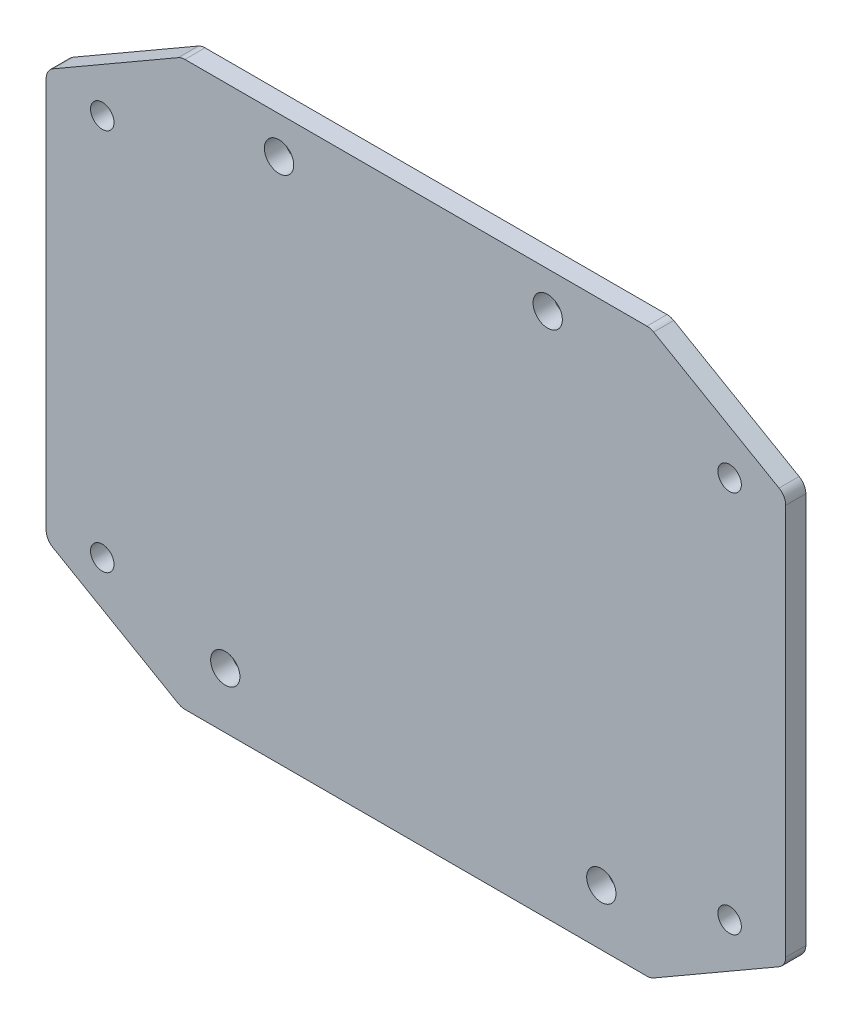
ISO-10303-21;
HEADER;
FILE_DESCRIPTION(('STEP AP214'),'2;1');
FILE_NAME('part.step','',(''),(''),'','','');
FILE_SCHEMA(('AUTOMOTIVE_DESIGN { 1 0 10303 214 1 1 1 1 }'));
ENDSEC;
DATA;
#1=APPLICATION_CONTEXT('core data for automotive mechanical design processes');
#2=APPLICATION_PROTOCOL_DEFINITION('international standard','automotive_design',2000,#1);
#3=PRODUCT_CONTEXT('',#1,'mechanical');
#4=PRODUCT('Part','Part','',(#3));
#5=PRODUCT_RELATED_PRODUCT_CATEGORY('part','',(#4));
#6=PRODUCT_DEFINITION_FORMATION('','',#4);
#7=PRODUCT_DEFINITION_CONTEXT('part definition',#1,'design');
#8=PRODUCT_DEFINITION('design','',#6,#7);
#9=PRODUCT_DEFINITION_SHAPE('','',#8);
#10=(LENGTH_UNIT() NAMED_UNIT(*) SI_UNIT(.MILLI.,.METRE.));
#11=(NAMED_UNIT(*) PLANE_ANGLE_UNIT() SI_UNIT($,.RADIAN.));
#12=(NAMED_UNIT(*) SI_UNIT($,.STERADIAN.) SOLID_ANGLE_UNIT());
#13=UNCERTAINTY_MEASURE_WITH_UNIT(LENGTH_MEASURE(1.E-05),#10,'distance_accuracy_value','');
#14=(GEOMETRIC_REPRESENTATION_CONTEXT(3) GLOBAL_UNCERTAINTY_ASSIGNED_CONTEXT((#13)) GLOBAL_UNIT_ASSIGNED_CONTEXT((#10,
#11,#12)) REPRESENTATION_CONTEXT('',''));
#15=CARTESIAN_POINT('',(0.,0.,0.));
#16=DIRECTION('',(0.,0.,1.));
#17=DIRECTION('',(1.,0.,0.));
#18=AXIS2_PLACEMENT_3D('',#15,#16,#17);
#19=CARTESIAN_POINT('',(-53.1674813519092,-10.4890002490225,3.));
#20=DIRECTION('',(0.,0.,-1.));
#21=DIRECTION('',(-1.,0.,0.));
#22=AXIS2_PLACEMENT_3D('',#19,#20,#21);
#23=CYLINDRICAL_SURFACE('',#22,2.);
#24=CARTESIAN_POINT('',(-53.1674813519092,-10.4890002490225,0.));
#25=DIRECTION('',(0.,0.,1.));
#26=DIRECTION('',(1.,0.,0.));
#27=AXIS2_PLACEMENT_3D('',#24,#25,#26);
#28=CIRCLE('',#27,2.);
#29=CARTESIAN_POINT('',(-55.1674813519092,-10.4890002490225,0.));
#30=VERTEX_POINT('',#29);
#31=CARTESIAN_POINT('',(-54.1674813519092,-12.2210510565914,0.));
#32=VERTEX_POINT('',#31);
#33=EDGE_CURVE('E142',#30,#32,#28,.T.);
#34=ORIENTED_EDGE('',*,*,#33,.T.);
#35=DIRECTION('',(0.,0.,-1.));
#36=VECTOR('',#35,1.);
#37=CARTESIAN_POINT('',(-54.1674813519092,-12.2210510565914,3.));
#38=LINE('',#37,#36);
#39=CARTESIAN_POINT('',(-54.1674813519092,-12.2210510565914,3.));
#40=VERTEX_POINT('',#39);
#41=EDGE_CURVE('E11',#40,#32,#38,.T.);
#42=ORIENTED_EDGE('',*,*,#41,.F.);
#43=CARTESIAN_POINT('',(-53.1674813519092,-10.4890002490225,3.));
#44=DIRECTION('',(0.,0.,1.));
#45=DIRECTION('',(1.,0.,0.));
#46=AXIS2_PLACEMENT_3D('',#43,#44,#45);
#47=CIRCLE('',#46,2.);
#48=CARTESIAN_POINT('',(-55.1674813519092,-10.4890002490225,3.));
#49=VERTEX_POINT('',#48);
#50=EDGE_CURVE('E160',#49,#40,#47,.T.);
#51=ORIENTED_EDGE('',*,*,#50,.F.);
#52=DIRECTION('',(0.,0.,-1.));
#53=VECTOR('',#52,1.);
#54=CARTESIAN_POINT('',(-55.1674813519092,-10.4890002490225,3.));
#55=LINE('',#54,#53);
#56=EDGE_CURVE('E141',#49,#30,#55,.T.);
#57=ORIENTED_EDGE('',*,*,#56,.T.);
#58=EDGE_LOOP('',(#34,#42,#51,#57));
#59=FACE_BOUND('',#58,.T.);
#60=ADVANCED_FACE('F35',(#59),#23,.T.);
#61=CARTESIAN_POINT('',(-54.1674813519092,-12.2210510565914,3.));
#62=DIRECTION('',(0.499999999999996,0.866025403784441,0.));
#63=DIRECTION('',(-0.866025403784441,0.499999999999997,0.));
#64=AXIS2_PLACEMENT_3D('',#61,#62,#63);
#65=PLANE('',#64);
#66=DIRECTION('',(0.866025403784441,-0.499999999999997,0.));
#67=VECTOR('',#66,1.);
#68=CARTESIAN_POINT('',(-54.1674813519092,-12.2210510565914,0.));
#69=LINE('',#68,#67);
#70=CARTESIAN_POINT('',(-35.4641016151378,-23.019452382372,0.));
#71=VERTEX_POINT('',#70);
#72=EDGE_CURVE('E145',#32,#71,#69,.T.);
#73=ORIENTED_EDGE('',*,*,#72,.T.);
#74=DIRECTION('',(0.,0.,-1.));
#75=VECTOR('',#74,1.);
#76=CARTESIAN_POINT('',(-35.4641016151378,-23.019452382372,3.));
#77=LINE('',#76,#75);
#78=CARTESIAN_POINT('',(-35.4641016151378,-23.019452382372,3.));
#79=VERTEX_POINT('',#78);
#80=EDGE_CURVE('E44',#79,#71,#77,.T.);
#81=ORIENTED_EDGE('',*,*,#80,.F.);
#82=DIRECTION('',(0.866025403784441,-0.499999999999997,0.));
#83=VECTOR('',#82,1.);
#84=CARTESIAN_POINT('',(-54.1674813519092,-12.2210510565914,3.));
#85=LINE('',#84,#83);
#86=EDGE_CURVE('E99',#40,#79,#85,.T.);
#87=ORIENTED_EDGE('',*,*,#86,.F.);
#88=ORIENTED_EDGE('',*,*,#41,.T.);
#89=EDGE_LOOP('',(#73,#81,#87,#88));
#90=FACE_BOUND('',#89,.T.);
#91=ADVANCED_FACE('F377',(#90),#65,.F.);
#92=CARTESIAN_POINT('',(-34.4641016151378,-21.2874015748031,3.));
#93=DIRECTION('',(0.,0.,-1.));
#94=DIRECTION('',(-1.,0.,0.));
#95=AXIS2_PLACEMENT_3D('',#92,#93,#94);
#96=CYLINDRICAL_SURFACE('',#95,2.);
#97=CARTESIAN_POINT('',(-34.4641016151378,-21.2874015748031,0.));
#98=DIRECTION('',(0.,0.,1.));
#99=DIRECTION('',(-1.,0.,0.));
#100=AXIS2_PLACEMENT_3D('',#97,#98,#99);
#101=CIRCLE('',#100,2.);
#102=CARTESIAN_POINT('',(-34.4641016151378,-23.2874015748031,0.));
#103=VERTEX_POINT('',#102);
#104=EDGE_CURVE('E148',#71,#103,#101,.T.);
#105=ORIENTED_EDGE('',*,*,#104,.T.);
#106=DIRECTION('',(0.,0.,-1.));
#107=VECTOR('',#106,1.);
#108=CARTESIAN_POINT('',(-34.4641016151378,-23.2874015748031,3.));
#109=LINE('',#108,#107);
#110=CARTESIAN_POINT('',(-34.4641016151378,-23.2874015748031,3.));
#111=VERTEX_POINT('',#110);
#112=EDGE_CURVE('E167',#111,#103,#109,.T.);
#113=ORIENTED_EDGE('',*,*,#112,.F.);
#114=CARTESIAN_POINT('',(-34.4641016151378,-21.2874015748031,3.));
#115=DIRECTION('',(0.,0.,1.));
#116=DIRECTION('',(-1.,0.,0.));
#117=AXIS2_PLACEMENT_3D('',#114,#115,#116);
#118=CIRCLE('',#117,2.);
#119=EDGE_CURVE('E284',#79,#111,#118,.T.);
#120=ORIENTED_EDGE('',*,*,#119,.F.);
#121=ORIENTED_EDGE('',*,*,#80,.T.);
#122=EDGE_LOOP('',(#105,#113,#120,#121));
#123=FACE_BOUND('',#122,.T.);
#124=ADVANCED_FACE('F382',(#123),#96,.T.);
#125=CARTESIAN_POINT('',(-34.4641016151378,-23.2874015748031,3.));
#126=DIRECTION('',(0.,1.,0.));
#127=DIRECTION('',(0.,0.,1.));
#128=AXIS2_PLACEMENT_3D('',#125,#126,#127);
#129=PLANE('',#128);
#130=DIRECTION('',(1.,0.,0.));
#131=VECTOR('',#130,1.);
#132=CARTESIAN_POINT('',(-34.4641016151378,-23.2874015748031,0.));
#133=LINE('',#132,#131);
#134=CARTESIAN_POINT('',(34.4641016151377,-23.2874015748031,0.));
#135=VERTEX_POINT('',#134);
#136=EDGE_CURVE('E150',#103,#135,#133,.T.);
#137=ORIENTED_EDGE('',*,*,#136,.T.);
#138=DIRECTION('',(0.,0.,-1.));
#139=VECTOR('',#138,1.);
#140=CARTESIAN_POINT('',(34.4641016151377,-23.2874015748031,3.));
#141=LINE('',#140,#139);
#142=CARTESIAN_POINT('',(34.4641016151377,-23.2874015748031,3.));
#143=VERTEX_POINT('',#142);
#144=EDGE_CURVE('E164',#143,#135,#141,.T.);
#145=ORIENTED_EDGE('',*,*,#144,.F.);
#146=DIRECTION('',(1.,0.,0.));
#147=VECTOR('',#146,1.);
#148=CARTESIAN_POINT('',(-34.4641016151378,-23.2874015748031,3.));
#149=LINE('',#148,#147);
#150=EDGE_CURVE('E286',#111,#143,#149,.T.);
#151=ORIENTED_EDGE('',*,*,#150,.F.);
#152=ORIENTED_EDGE('',*,*,#112,.T.);
#153=EDGE_LOOP('',(#137,#145,#151,#152));
#154=FACE_BOUND('',#153,.T.);
#155=ADVANCED_FACE('F292',(#154),#129,.F.);
#156=CARTESIAN_POINT('',(34.4641016151377,-21.2874015748031,3.));
#157=DIRECTION('',(0.,0.,-1.));
#158=DIRECTION('',(-1.,0.,0.));
#159=AXIS2_PLACEMENT_3D('',#156,#157,#158);
#160=CYLINDRICAL_SURFACE('',#159,2.);
#161=CARTESIAN_POINT('',(34.4641016151377,-21.2874015748031,0.));
#162=DIRECTION('',(0.,0.,1.));
#163=DIRECTION('',(1.,0.,0.));
#164=AXIS2_PLACEMENT_3D('',#161,#162,#163);
#165=CIRCLE('',#164,2.);
#166=CARTESIAN_POINT('',(35.4641016151378,-23.019452382372,0.));
#167=VERTEX_POINT('',#166);
#168=EDGE_CURVE('E152',#135,#167,#165,.T.);
#169=ORIENTED_EDGE('',*,*,#168,.T.);
#170=DIRECTION('',(0.,0.,-1.));
#171=VECTOR('',#170,1.);
#172=CARTESIAN_POINT('',(35.4641016151378,-23.019452382372,3.));
#173=LINE('',#172,#171);
#174=CARTESIAN_POINT('',(35.4641016151378,-23.019452382372,3.));
#175=VERTEX_POINT('',#174);
#176=EDGE_CURVE('E130',#175,#167,#173,.T.);
#177=ORIENTED_EDGE('',*,*,#176,.F.);
#178=CARTESIAN_POINT('',(34.4641016151377,-21.2874015748031,3.));
#179=DIRECTION('',(0.,0.,1.));
#180=DIRECTION('',(1.,0.,0.));
#181=AXIS2_PLACEMENT_3D('',#178,#179,#180);
#182=CIRCLE('',#181,2.);
#183=EDGE_CURVE('E121',#143,#175,#182,.T.);
#184=ORIENTED_EDGE('',*,*,#183,.F.);
#185=ORIENTED_EDGE('',*,*,#144,.T.);
#186=EDGE_LOOP('',(#169,#177,#184,#185));
#187=FACE_BOUND('',#186,.T.);
#188=ADVANCED_FACE('F296',(#187),#160,.T.);
#189=CARTESIAN_POINT('',(35.4641016151378,-23.019452382372,3.));
#190=DIRECTION('',(-0.500000000000006,0.866025403784435,0.));
#191=DIRECTION('',(-0.866025403784435,-0.500000000000006,0.));
#192=AXIS2_PLACEMENT_3D('',#189,#190,#191);
#193=PLANE('',#192);
#194=DIRECTION('',(0.866025403784435,0.500000000000006,0.));
#195=VECTOR('',#194,1.);
#196=CARTESIAN_POINT('',(35.4641016151378,-23.019452382372,0.));
#197=LINE('',#196,#195);
#198=CARTESIAN_POINT('',(54.1674813519094,-12.221051056591,0.));
#199=VERTEX_POINT('',#198);
#200=EDGE_CURVE('E129',#167,#199,#197,.T.);
#201=ORIENTED_EDGE('',*,*,#200,.T.);
#202=DIRECTION('',(0.,0.,-1.));
#203=VECTOR('',#202,1.);
#204=CARTESIAN_POINT('',(54.1674813519094,-12.221051056591,3.));
#205=LINE('',#204,#203);
#206=CARTESIAN_POINT('',(54.1674813519094,-12.221051056591,3.));
#207=VERTEX_POINT('',#206);
#208=EDGE_CURVE('E126',#207,#199,#205,.T.);
#209=ORIENTED_EDGE('',*,*,#208,.F.);
#210=DIRECTION('',(0.866025403784435,0.500000000000006,0.));
#211=VECTOR('',#210,1.);
#212=CARTESIAN_POINT('',(35.4641016151378,-23.019452382372,3.));
#213=LINE('',#212,#211);
#214=EDGE_CURVE('E114',#175,#207,#213,.T.);
#215=ORIENTED_EDGE('',*,*,#214,.F.);
#216=ORIENTED_EDGE('',*,*,#176,.T.);
#217=EDGE_LOOP('',(#201,#209,#215,#216));
#218=FACE_BOUND('',#217,.T.);
#219=ADVANCED_FACE('F127',(#218),#193,.F.);
#220=CARTESIAN_POINT('',(53.1674813519094,-10.4890002490221,3.));
#221=DIRECTION('',(0.,0.,-1.));
#222=DIRECTION('',(-1.,0.,0.));
#223=AXIS2_PLACEMENT_3D('',#220,#221,#222);
#224=CYLINDRICAL_SURFACE('',#223,2.);
#225=CARTESIAN_POINT('',(53.1674813519094,-10.4890002490221,0.));
#226=DIRECTION('',(0.,0.,1.));
#227=DIRECTION('',(1.,0.,0.));
#228=AXIS2_PLACEMENT_3D('',#225,#226,#227);
#229=CIRCLE('',#228,2.);
#230=CARTESIAN_POINT('',(55.1674813519094,-10.489000249022,0.));
#231=VERTEX_POINT('',#230);
#232=EDGE_CURVE('E84',#199,#231,#229,.T.);
#233=ORIENTED_EDGE('',*,*,#232,.T.);
#234=DIRECTION('',(0.,0.,-1.));
#235=VECTOR('',#234,1.);
#236=CARTESIAN_POINT('',(55.1674813519094,-10.489000249022,3.));
#237=LINE('',#236,#235);
#238=CARTESIAN_POINT('',(55.1674813519094,-10.489000249022,3.));
#239=VERTEX_POINT('',#238);
#240=EDGE_CURVE('E131',#239,#231,#237,.T.);
#241=ORIENTED_EDGE('',*,*,#240,.F.);
#242=CARTESIAN_POINT('',(53.1674813519094,-10.4890002490221,3.));
#243=DIRECTION('',(0.,0.,1.));
#244=DIRECTION('',(1.,0.,0.));
#245=AXIS2_PLACEMENT_3D('',#242,#243,#244);
#246=CIRCLE('',#245,2.);
#247=EDGE_CURVE('E119',#207,#239,#246,.T.);
#248=ORIENTED_EDGE('',*,*,#247,.F.);
#249=ORIENTED_EDGE('',*,*,#208,.T.);
#250=EDGE_LOOP('',(#233,#241,#248,#249));
#251=FACE_BOUND('',#250,.T.);
#252=ADVANCED_FACE('F133',(#251),#224,.T.);
#253=CARTESIAN_POINT('',(55.1674813519094,-10.489000249022,3.));
#254=DIRECTION('',(-1.,0.,0.));
#255=DIRECTION('',(0.,-1.,0.));
#256=AXIS2_PLACEMENT_3D('',#253,#254,#255);
#257=PLANE('',#256);
#258=DIRECTION('',(0.,1.,0.));
#259=VECTOR('',#258,1.);
#260=CARTESIAN_POINT('',(55.1674813519094,-10.489000249022,0.));
#261=LINE('',#260,#259);
#262=CARTESIAN_POINT('',(55.1674813519091,47.902578960495,0.));
#263=VERTEX_POINT('',#262);
#264=EDGE_CURVE('E156',#231,#263,#261,.T.);
#265=ORIENTED_EDGE('',*,*,#264,.T.);
#266=DIRECTION('',(0.,0.,1.));
#267=VECTOR('',#266,1.);
#268=CARTESIAN_POINT('',(55.1674813519091,47.9025789604951,-113.713948381466));
#269=LINE('',#268,#267);
#270=CARTESIAN_POINT('',(55.1674813519091,47.9025789604951,3.));
#271=VERTEX_POINT('',#270);
#272=EDGE_CURVE('E257',#263,#271,#269,.T.);
#273=ORIENTED_EDGE('',*,*,#272,.T.);
#274=DIRECTION('',(0.,1.,0.));
#275=VECTOR('',#274,1.);
#276=CARTESIAN_POINT('',(55.1674813519094,-10.489000249022,3.));
#277=LINE('',#276,#275);
#278=EDGE_CURVE('E135',#239,#271,#277,.T.);
#279=ORIENTED_EDGE('',*,*,#278,.F.);
#280=ORIENTED_EDGE('',*,*,#240,.T.);
#281=EDGE_LOOP('',(#265,#273,#279,#280));
#282=FACE_BOUND('',#281,.T.);
#283=ADVANCED_FACE('F305',(#282),#257,.F.);
#284=CARTESIAN_POINT('',(-55.1674813519093,10.4890002490222,3.));
#285=DIRECTION('',(1.,0.,0.));
#286=DIRECTION('',(0.,1.,0.));
#287=AXIS2_PLACEMENT_3D('',#284,#285,#286);
#288=PLANE('',#287);
#289=ORIENTED_EDGE('',*,*,#56,.F.);
#290=DIRECTION('',(0.,-1.,0.));
#291=VECTOR('',#290,1.);
#292=CARTESIAN_POINT('',(-55.1674813519093,10.4890002490222,3.));
#293=LINE('',#292,#291);
#294=CARTESIAN_POINT('',(-55.1674813519093,47.9025789604946,3.));
#295=VERTEX_POINT('',#294);
#296=EDGE_CURVE('E53',#295,#49,#293,.T.);
#297=ORIENTED_EDGE('',*,*,#296,.F.);
#298=DIRECTION('',(0.,0.,1.));
#299=VECTOR('',#298,1.);
#300=CARTESIAN_POINT('',(-55.1674813519093,47.9025789604946,-113.713948381466));
#301=LINE('',#300,#299);
#302=CARTESIAN_POINT('',(-55.1674813519093,47.9025789604946,0.));
#303=VERTEX_POINT('',#302);
#304=EDGE_CURVE('E223',#303,#295,#301,.T.);
#305=ORIENTED_EDGE('',*,*,#304,.F.);
#306=DIRECTION('',(0.,-1.,0.));
#307=VECTOR('',#306,1.);
#308=CARTESIAN_POINT('',(-55.1674813519093,10.4890002490222,0.));
#309=LINE('',#308,#307);
#310=EDGE_CURVE('E91',#303,#30,#309,.T.);
#311=ORIENTED_EDGE('',*,*,#310,.T.);
#312=EDGE_LOOP('',(#289,#297,#305,#311));
#313=FACE_BOUND('',#312,.T.);
#314=ADVANCED_FACE('F349',(#313),#288,.F.);
#315=CARTESIAN_POINT('',(-53.1674813519092,-10.4890002490225,3.));
#316=DIRECTION('',(0.,0.,1.));
#317=DIRECTION('',(1.,0.,0.));
#318=AXIS2_PLACEMENT_3D('',#315,#316,#317);
#319=PLANE('',#318);
#320=CARTESIAN_POINT('',(-46.7986018852853,47.2556160159071,3.));
#321=DIRECTION('',(0.,0.,1.));
#322=DIRECTION('',(-1.,0.,0.));
#323=AXIS2_PLACEMENT_3D('',#320,#321,#322);
#324=CIRCLE('',#323,1.75);
#325=CARTESIAN_POINT('',(-48.5486018852853,47.2556160159071,3.));
#326=VERTEX_POINT('',#325);
#327=EDGE_CURVE('E195',#326,#326,#324,.T.);
#328=ORIENTED_EDGE('',*,*,#327,.F.);
#329=EDGE_LOOP('',(#328));
#330=FACE_BOUND('',#329,.T.);
#331=CARTESIAN_POINT('',(46.7986018852853,-9.84203730443492,3.));
#332=DIRECTION('',(0.,0.,1.));
#333=DIRECTION('',(-1.,0.,0.));
#334=AXIS2_PLACEMENT_3D('',#331,#332,#333);
#335=CIRCLE('',#334,1.75);
#336=CARTESIAN_POINT('',(45.0486018852853,-9.84203730443492,3.));
#337=VERTEX_POINT('',#336);
#338=EDGE_CURVE('E636',#337,#337,#335,.T.);
#339=ORIENTED_EDGE('',*,*,#338,.F.);
#340=EDGE_LOOP('',(#339));
#341=FACE_BOUND('',#340,.T.);
#342=CARTESIAN_POINT('',(-46.7986018852853,-9.84203730443492,3.));
#343=DIRECTION('',(0.,0.,1.));
#344=DIRECTION('',(1.,0.,0.));
#345=AXIS2_PLACEMENT_3D('',#342,#343,#344);
#346=CIRCLE('',#345,1.75);
#347=CARTESIAN_POINT('',(-45.0486018852853,-9.84203730443492,3.));
#348=VERTEX_POINT('',#347);
#349=EDGE_CURVE('E208',#348,#348,#346,.T.);
#350=ORIENTED_EDGE('',*,*,#349,.F.);
#351=EDGE_LOOP('',(#350));
#352=FACE_BOUND('',#351,.T.);
#353=CARTESIAN_POINT('',(46.7986018852853,47.2556160159071,3.));
#354=DIRECTION('',(0.,0.,1.));
#355=DIRECTION('',(1.,0.,0.));
#356=AXIS2_PLACEMENT_3D('',#353,#354,#355);
#357=CIRCLE('',#356,1.75);
#358=CARTESIAN_POINT('',(48.5486018852853,47.2556160159071,3.));
#359=VERTEX_POINT('',#358);
#360=EDGE_CURVE('E191',#359,#359,#357,.T.);
#361=ORIENTED_EDGE('',*,*,#360,.F.);
#362=EDGE_LOOP('',(#361));
#363=FACE_BOUND('',#362,.T.);
#364=CARTESIAN_POINT('',(19.655486732502,55.2218442099161,3.));
#365=DIRECTION('',(0.,0.,1.));
#366=DIRECTION('',(1.,0.,0.));
#367=AXIS2_PLACEMENT_3D('',#364,#365,#366);
#368=CIRCLE('',#367,2.18709874860831);
#369=CARTESIAN_POINT('',(21.8425854811103,55.2218442099161,3.));
#370=VERTEX_POINT('',#369);
#371=EDGE_CURVE('E181',#370,#370,#368,.T.);
#372=ORIENTED_EDGE('',*,*,#371,.F.);
#373=EDGE_LOOP('',(#372));
#374=FACE_BOUND('',#373,.T.);
#375=CARTESIAN_POINT('',(27.6586972851949,-14.9598894501086,3.));
#376=DIRECTION('',(0.,0.,1.));
#377=DIRECTION('',(1.,0.,0.));
#378=AXIS2_PLACEMENT_3D('',#375,#376,#377);
#379=CIRCLE('',#378,2.18709874860831);
#380=CARTESIAN_POINT('',(29.8457960338032,-14.9598894501086,3.));
#381=VERTEX_POINT('',#380);
#382=EDGE_CURVE('E212',#381,#381,#379,.T.);
#383=ORIENTED_EDGE('',*,*,#382,.F.);
#384=EDGE_LOOP('',(#383));
#385=FACE_BOUND('',#384,.T.);
#386=CARTESIAN_POINT('',(-28.4477241149635,-14.9598894501086,3.));
#387=DIRECTION('',(0.,0.,1.));
#388=DIRECTION('',(1.,0.,0.));
#389=AXIS2_PLACEMENT_3D('',#386,#387,#388);
#390=CIRCLE('',#389,2.18709874860831);
#391=CARTESIAN_POINT('',(-26.2606253663552,-14.9598894501086,3.));
#392=VERTEX_POINT('',#391);
#393=EDGE_CURVE('E190',#392,#392,#390,.T.);
#394=ORIENTED_EDGE('',*,*,#393,.F.);
#395=EDGE_LOOP('',(#394));
#396=FACE_BOUND('',#395,.T.);
#397=CARTESIAN_POINT('',(-20.4245771974051,55.1618805558779,3.));
#398=DIRECTION('',(0.,0.,1.));
#399=DIRECTION('',(1.,0.,0.));
#400=AXIS2_PLACEMENT_3D('',#397,#398,#399);
#401=CIRCLE('',#400,2.18709874860831);
#402=CARTESIAN_POINT('',(-18.2374784487968,55.1618805558779,3.));
#403=VERTEX_POINT('',#402);
#404=EDGE_CURVE('E176',#403,#403,#401,.T.);
#405=ORIENTED_EDGE('',*,*,#404,.F.);
#406=EDGE_LOOP('',(#405));
#407=FACE_BOUND('',#406,.T.);
#408=ORIENTED_EDGE('',*,*,#278,.T.);
#409=CARTESIAN_POINT('',(53.1674813519091,47.902578960495,3.));
#410=DIRECTION('',(0.,0.,1.));
#411=DIRECTION('',(1.,0.,0.));
#412=AXIS2_PLACEMENT_3D('',#409,#410,#411);
#413=CIRCLE('',#412,1.99999999999999);
#414=CARTESIAN_POINT('',(54.1674813519091,49.6346297680639,3.));
#415=VERTEX_POINT('',#414);
#416=EDGE_CURVE('E175',#271,#415,#413,.T.);
#417=ORIENTED_EDGE('',*,*,#416,.T.);
#418=DIRECTION('',(-0.866025403784442,0.499999999999993,0.));
#419=VECTOR('',#418,1.);
#420=CARTESIAN_POINT('',(54.1674813519091,49.6346297680639,3.));
#421=LINE('',#420,#419);
#422=CARTESIAN_POINT('',(35.4641016151378,60.4330310938445,3.));
#423=VERTEX_POINT('',#422);
#424=EDGE_CURVE('E240',#415,#423,#421,.T.);
#425=ORIENTED_EDGE('',*,*,#424,.T.);
#426=CARTESIAN_POINT('',(34.4641016151378,58.7009802862756,3.));
#427=DIRECTION('',(0.,0.,1.));
#428=DIRECTION('',(1.,0.,0.));
#429=AXIS2_PLACEMENT_3D('',#426,#427,#428);
#430=CIRCLE('',#429,1.99999999999999);
#431=CARTESIAN_POINT('',(34.4641016151378,60.7009802862756,3.));
#432=VERTEX_POINT('',#431);
#433=EDGE_CURVE('E243',#423,#432,#430,.T.);
#434=ORIENTED_EDGE('',*,*,#433,.T.);
#435=DIRECTION('',(-1.,0.,0.));
#436=VECTOR('',#435,1.);
#437=CARTESIAN_POINT('',(34.4641016151378,60.7009802862756,3.));
#438=LINE('',#437,#436);
#439=CARTESIAN_POINT('',(-34.4641016151377,60.7009802862756,3.));
#440=VERTEX_POINT('',#439);
#441=EDGE_CURVE('E246',#432,#440,#438,.T.);
#442=ORIENTED_EDGE('',*,*,#441,.T.);
#443=CARTESIAN_POINT('',(-34.4641016151378,58.7009802862756,3.));
#444=DIRECTION('',(0.,0.,1.));
#445=DIRECTION('',(1.,0.,0.));
#446=AXIS2_PLACEMENT_3D('',#443,#444,#445);
#447=CIRCLE('',#446,1.99999999999999);
#448=CARTESIAN_POINT('',(-35.4641016151378,60.4330310938444,3.));
#449=VERTEX_POINT('',#448);
#450=EDGE_CURVE('E249',#440,#449,#447,.T.);
#451=ORIENTED_EDGE('',*,*,#450,.T.);
#452=DIRECTION('',(-0.866025403784437,-0.500000000000002,0.));
#453=VECTOR('',#452,1.);
#454=CARTESIAN_POINT('',(-35.4641016151378,60.4330310938444,3.));
#455=LINE('',#454,#453);
#456=CARTESIAN_POINT('',(-54.1674813519093,49.6346297680635,3.));
#457=VERTEX_POINT('',#456);
#458=EDGE_CURVE('E252',#449,#457,#455,.T.);
#459=ORIENTED_EDGE('',*,*,#458,.T.);
#460=CARTESIAN_POINT('',(-53.1674813519093,47.9025789604946,3.));
#461=DIRECTION('',(0.,0.,1.));
#462=DIRECTION('',(1.,0.,0.));
#463=AXIS2_PLACEMENT_3D('',#460,#461,#462);
#464=CIRCLE('',#463,2.);
#465=EDGE_CURVE('E255',#457,#295,#464,.T.);
#466=ORIENTED_EDGE('',*,*,#465,.T.);
#467=ORIENTED_EDGE('',*,*,#296,.T.);
#468=ORIENTED_EDGE('',*,*,#50,.T.);
#469=ORIENTED_EDGE('',*,*,#86,.T.);
#470=ORIENTED_EDGE('',*,*,#119,.T.);
#471=ORIENTED_EDGE('',*,*,#150,.T.);
#472=ORIENTED_EDGE('',*,*,#183,.T.);
#473=ORIENTED_EDGE('',*,*,#214,.T.);
#474=ORIENTED_EDGE('',*,*,#247,.T.);
#475=EDGE_LOOP('',(#408,#417,#425,#434,#442,#451,#459,#466,#467,#468,#469,#470,#471,#472,#473,#474));
#476=FACE_BOUND('',#475,.T.);
#477=ADVANCED_FACE('F117',(#330,#341,#352,#363,#374,#385,#396,#407,#476),#319,.T.);
#478=CARTESIAN_POINT('',(-53.1674813519092,-10.4890002490225,0.));
#479=DIRECTION('',(0.,0.,1.));
#480=DIRECTION('',(1.,0.,0.));
#481=AXIS2_PLACEMENT_3D('',#478,#479,#480);
#482=PLANE('',#481);
#483=CARTESIAN_POINT('',(-46.7986018852853,47.2556160159071,0.));
#484=DIRECTION('',(0.,0.,1.));
#485=DIRECTION('',(1.,0.,0.));
#486=AXIS2_PLACEMENT_3D('',#483,#484,#485);
#487=CIRCLE('',#486,1.75);
#488=CARTESIAN_POINT('',(-45.0486018852853,47.2556160159071,0.));
#489=VERTEX_POINT('',#488);
#490=EDGE_CURVE('E38',#489,#489,#487,.T.);
#491=ORIENTED_EDGE('',*,*,#490,.T.);
#492=EDGE_LOOP('',(#491));
#493=FACE_BOUND('',#492,.T.);
#494=CARTESIAN_POINT('',(46.7986018852853,-9.84203730443492,0.));
#495=DIRECTION('',(0.,0.,1.));
#496=DIRECTION('',(1.,0.,0.));
#497=AXIS2_PLACEMENT_3D('',#494,#495,#496);
#498=CIRCLE('',#497,1.75);
#499=CARTESIAN_POINT('',(48.5486018852853,-9.84203730443492,0.));
#500=VERTEX_POINT('',#499);
#501=EDGE_CURVE('E194',#500,#500,#498,.T.);
#502=ORIENTED_EDGE('',*,*,#501,.T.);
#503=EDGE_LOOP('',(#502));
#504=FACE_BOUND('',#503,.T.);
#505=CARTESIAN_POINT('',(-46.7986018852853,-9.84203730443492,0.));
#506=DIRECTION('',(0.,0.,1.));
#507=DIRECTION('',(1.,0.,0.));
#508=AXIS2_PLACEMENT_3D('',#505,#506,#507);
#509=CIRCLE('',#508,1.75);
#510=CARTESIAN_POINT('',(-45.0486018852853,-9.84203730443492,0.));
#511=VERTEX_POINT('',#510);
#512=EDGE_CURVE('E192',#511,#511,#509,.T.);
#513=ORIENTED_EDGE('',*,*,#512,.T.);
#514=EDGE_LOOP('',(#513));
#515=FACE_BOUND('',#514,.T.);
#516=CARTESIAN_POINT('',(46.7986018852853,47.2556160159071,0.));
#517=DIRECTION('',(0.,0.,1.));
#518=DIRECTION('',(1.,0.,0.));
#519=AXIS2_PLACEMENT_3D('',#516,#517,#518);
#520=CIRCLE('',#519,1.75);
#521=CARTESIAN_POINT('',(48.5486018852853,47.2556160159071,0.));
#522=VERTEX_POINT('',#521);
#523=EDGE_CURVE('E187',#522,#522,#520,.T.);
#524=ORIENTED_EDGE('',*,*,#523,.T.);
#525=EDGE_LOOP('',(#524));
#526=FACE_BOUND('',#525,.T.);
#527=CARTESIAN_POINT('',(19.655486732502,55.2218442099161,0.));
#528=DIRECTION('',(0.,0.,1.));
#529=DIRECTION('',(1.,0.,0.));
#530=AXIS2_PLACEMENT_3D('',#527,#528,#529);
#531=CIRCLE('',#530,2.18709874860831);
#532=CARTESIAN_POINT('',(21.8425854811103,55.2218442099161,0.));
#533=VERTEX_POINT('',#532);
#534=EDGE_CURVE('E184',#533,#533,#531,.T.);
#535=ORIENTED_EDGE('',*,*,#534,.T.);
#536=EDGE_LOOP('',(#535));
#537=FACE_BOUND('',#536,.T.);
#538=CARTESIAN_POINT('',(27.6586972851949,-14.9598894501086,0.));
#539=DIRECTION('',(0.,0.,1.));
#540=DIRECTION('',(1.,0.,0.));
#541=AXIS2_PLACEMENT_3D('',#538,#539,#540);
#542=CIRCLE('',#541,2.18709874860831);
#543=CARTESIAN_POINT('',(29.8457960338032,-14.9598894501086,0.));
#544=VERTEX_POINT('',#543);
#545=EDGE_CURVE('E180',#544,#544,#542,.T.);
#546=ORIENTED_EDGE('',*,*,#545,.T.);
#547=EDGE_LOOP('',(#546));
#548=FACE_BOUND('',#547,.T.);
#549=CARTESIAN_POINT('',(-28.4477241149635,-14.9598894501086,0.));
#550=DIRECTION('',(0.,0.,1.));
#551=DIRECTION('',(1.,0.,0.));
#552=AXIS2_PLACEMENT_3D('',#549,#550,#551);
#553=CIRCLE('',#552,2.18709874860831);
#554=CARTESIAN_POINT('',(-26.2606253663552,-14.9598894501086,0.));
#555=VERTEX_POINT('',#554);
#556=EDGE_CURVE('E177',#555,#555,#553,.T.);
#557=ORIENTED_EDGE('',*,*,#556,.T.);
#558=EDGE_LOOP('',(#557));
#559=FACE_BOUND('',#558,.T.);
#560=CARTESIAN_POINT('',(-20.4245771974051,55.1618805558779,0.));
#561=DIRECTION('',(0.,0.,1.));
#562=DIRECTION('',(1.,0.,0.));
#563=AXIS2_PLACEMENT_3D('',#560,#561,#562);
#564=CIRCLE('',#563,2.18709874860831);
#565=CARTESIAN_POINT('',(-18.2374784487968,55.1618805558779,0.));
#566=VERTEX_POINT('',#565);
#567=EDGE_CURVE('E172',#566,#566,#564,.T.);
#568=ORIENTED_EDGE('',*,*,#567,.T.);
#569=EDGE_LOOP('',(#568));
#570=FACE_BOUND('',#569,.T.);
#571=ORIENTED_EDGE('',*,*,#33,.F.);
#572=ORIENTED_EDGE('',*,*,#310,.F.);
#573=CARTESIAN_POINT('',(-53.1674813519093,47.9025789604946,0.));
#574=DIRECTION('',(0.,0.,1.));
#575=DIRECTION('',(1.,0.,0.));
#576=AXIS2_PLACEMENT_3D('',#573,#574,#575);
#577=CIRCLE('',#576,2.);
#578=CARTESIAN_POINT('',(-54.1674813519093,49.6346297680635,0.));
#579=VERTEX_POINT('',#578);
#580=EDGE_CURVE('E235',#303,#579,#577,.F.);
#581=ORIENTED_EDGE('',*,*,#580,.T.);
#582=DIRECTION('',(0.866025403784438,0.500000000000002,0.));
#583=VECTOR('',#582,1.);
#584=CARTESIAN_POINT('',(-35.4641016151378,60.4330310938444,0.));
#585=LINE('',#584,#583);
#586=CARTESIAN_POINT('',(-35.4641016151378,60.4330310938444,0.));
#587=VERTEX_POINT('',#586);
#588=EDGE_CURVE('E232',#579,#587,#585,.T.);
#589=ORIENTED_EDGE('',*,*,#588,.T.);
#590=CARTESIAN_POINT('',(-34.4641016151378,58.7009802862756,0.));
#591=DIRECTION('',(0.,0.,1.));
#592=DIRECTION('',(1.,0.,0.));
#593=AXIS2_PLACEMENT_3D('',#590,#591,#592);
#594=CIRCLE('',#593,1.99999999999999);
#595=CARTESIAN_POINT('',(-34.4641016151378,60.7009802862756,0.));
#596=VERTEX_POINT('',#595);
#597=EDGE_CURVE('E229',#587,#596,#594,.F.);
#598=ORIENTED_EDGE('',*,*,#597,.T.);
#599=DIRECTION('',(1.,0.,0.));
#600=VECTOR('',#599,1.);
#601=CARTESIAN_POINT('',(34.4641016151378,60.7009802862756,0.));
#602=LINE('',#601,#600);
#603=CARTESIAN_POINT('',(34.4641016151378,60.7009802862756,0.));
#604=VERTEX_POINT('',#603);
#605=EDGE_CURVE('E226',#596,#604,#602,.T.);
#606=ORIENTED_EDGE('',*,*,#605,.T.);
#607=CARTESIAN_POINT('',(34.4641016151378,58.7009802862756,0.));
#608=DIRECTION('',(0.,0.,1.));
#609=DIRECTION('',(1.,0.,0.));
#610=AXIS2_PLACEMENT_3D('',#607,#608,#609);
#611=CIRCLE('',#610,1.99999999999999);
#612=CARTESIAN_POINT('',(35.4641016151378,60.4330310938445,0.));
#613=VERTEX_POINT('',#612);
#614=EDGE_CURVE('E222',#604,#613,#611,.F.);
#615=ORIENTED_EDGE('',*,*,#614,.T.);
#616=DIRECTION('',(0.866025403784443,-0.499999999999994,0.));
#617=VECTOR('',#616,1.);
#618=CARTESIAN_POINT('',(54.1674813519091,49.6346297680639,0.));
#619=LINE('',#618,#617);
#620=CARTESIAN_POINT('',(54.1674813519091,49.6346297680639,0.));
#621=VERTEX_POINT('',#620);
#622=EDGE_CURVE('E219',#613,#621,#619,.T.);
#623=ORIENTED_EDGE('',*,*,#622,.T.);
#624=CARTESIAN_POINT('',(53.1674813519091,47.902578960495,0.));
#625=DIRECTION('',(0.,0.,1.));
#626=DIRECTION('',(1.,0.,0.));
#627=AXIS2_PLACEMENT_3D('',#624,#625,#626);
#628=CIRCLE('',#627,1.99999999999999);
#629=EDGE_CURVE('E146',#621,#263,#628,.F.);
#630=ORIENTED_EDGE('',*,*,#629,.T.);
#631=ORIENTED_EDGE('',*,*,#264,.F.);
#632=ORIENTED_EDGE('',*,*,#232,.F.);
#633=ORIENTED_EDGE('',*,*,#200,.F.);
#634=ORIENTED_EDGE('',*,*,#168,.F.);
#635=ORIENTED_EDGE('',*,*,#136,.F.);
#636=ORIENTED_EDGE('',*,*,#104,.F.);
#637=ORIENTED_EDGE('',*,*,#72,.F.);
#638=EDGE_LOOP('',(#571,#572,#581,#589,#598,#606,#615,#623,#630,#631,#632,#633,#634,#635,#636,#637));
#639=FACE_BOUND('',#638,.T.);
#640=ADVANCED_FACE('F299',(#493,#504,#515,#526,#537,#548,#559,#570,#639),#482,.F.);
#641=CARTESIAN_POINT('',(-53.1674813519093,47.9025789604946,-113.713948381466));
#642=DIRECTION('',(0.,0.,1.));
#643=DIRECTION('',(1.,0.,0.));
#644=AXIS2_PLACEMENT_3D('',#641,#642,#643);
#645=CYLINDRICAL_SURFACE('',#644,2.);
#646=ORIENTED_EDGE('',*,*,#580,.F.);
#647=ORIENTED_EDGE('',*,*,#304,.T.);
#648=ORIENTED_EDGE('',*,*,#465,.F.);
#649=DIRECTION('',(0.,0.,1.));
#650=VECTOR('',#649,1.);
#651=CARTESIAN_POINT('',(-54.1674813519093,49.6346297680635,-113.713948381466));
#652=LINE('',#651,#650);
#653=EDGE_CURVE('E260',#579,#457,#652,.T.);
#654=ORIENTED_EDGE('',*,*,#653,.F.);
#655=EDGE_LOOP('',(#646,#647,#648,#654));
#656=FACE_BOUND('',#655,.T.);
#657=ADVANCED_FACE('F354',(#656),#645,.T.);
#658=CARTESIAN_POINT('',(-35.4641016151378,60.4330310938444,-113.713948381466));
#659=DIRECTION('',(-0.500000000000002,0.866025403784437,0.));
#660=DIRECTION('',(-0.866025403784438,-0.500000000000002,0.));
#661=AXIS2_PLACEMENT_3D('',#658,#659,#660);
#662=PLANE('',#661);
#663=ORIENTED_EDGE('',*,*,#588,.F.);
#664=ORIENTED_EDGE('',*,*,#653,.T.);
#665=ORIENTED_EDGE('',*,*,#458,.F.);
#666=DIRECTION('',(0.,0.,1.));
#667=VECTOR('',#666,1.);
#668=CARTESIAN_POINT('',(-35.4641016151378,60.4330310938444,-113.713948381466));
#669=LINE('',#668,#667);
#670=EDGE_CURVE('E263',#587,#449,#669,.T.);
#671=ORIENTED_EDGE('',*,*,#670,.F.);
#672=EDGE_LOOP('',(#663,#664,#665,#671));
#673=FACE_BOUND('',#672,.T.);
#674=ADVANCED_FACE('F361',(#673),#662,.T.);
#675=CARTESIAN_POINT('',(-34.4641016151378,58.7009802862756,-113.713948381466));
#676=DIRECTION('',(0.,0.,1.));
#677=DIRECTION('',(1.,0.,0.));
#678=AXIS2_PLACEMENT_3D('',#675,#676,#677);
#679=CYLINDRICAL_SURFACE('',#678,1.99999999999999);
#680=ORIENTED_EDGE('',*,*,#597,.F.);
#681=ORIENTED_EDGE('',*,*,#670,.T.);
#682=ORIENTED_EDGE('',*,*,#450,.F.);
#683=DIRECTION('',(0.,0.,1.));
#684=VECTOR('',#683,1.);
#685=CARTESIAN_POINT('',(-34.4641016151377,60.7009802862756,-113.713948381466));
#686=LINE('',#685,#684);
#687=EDGE_CURVE('E266',#596,#440,#686,.T.);
#688=ORIENTED_EDGE('',*,*,#687,.F.);
#689=EDGE_LOOP('',(#680,#681,#682,#688));
#690=FACE_BOUND('',#689,.T.);
#691=ADVANCED_FACE('F365',(#690),#679,.T.);
#692=CARTESIAN_POINT('',(34.4641016151378,60.7009802862756,-113.713948381466));
#693=DIRECTION('',(0.,1.,0.));
#694=DIRECTION('',(0.,0.,1.));
#695=AXIS2_PLACEMENT_3D('',#692,#693,#694);
#696=PLANE('',#695);
#697=ORIENTED_EDGE('',*,*,#605,.F.);
#698=ORIENTED_EDGE('',*,*,#687,.T.);
#699=ORIENTED_EDGE('',*,*,#441,.F.);
#700=DIRECTION('',(0.,0.,1.));
#701=VECTOR('',#700,1.);
#702=CARTESIAN_POINT('',(34.4641016151378,60.7009802862756,-113.713948381466));
#703=LINE('',#702,#701);
#704=EDGE_CURVE('E269',#604,#432,#703,.T.);
#705=ORIENTED_EDGE('',*,*,#704,.F.);
#706=EDGE_LOOP('',(#697,#698,#699,#705));
#707=FACE_BOUND('',#706,.T.);
#708=ADVANCED_FACE('F367',(#707),#696,.T.);
#709=CARTESIAN_POINT('',(34.4641016151378,58.7009802862756,-113.713948381466));
#710=DIRECTION('',(0.,0.,1.));
#711=DIRECTION('',(1.,0.,0.));
#712=AXIS2_PLACEMENT_3D('',#709,#710,#711);
#713=CYLINDRICAL_SURFACE('',#712,1.99999999999999);
#714=ORIENTED_EDGE('',*,*,#614,.F.);
#715=ORIENTED_EDGE('',*,*,#704,.T.);
#716=ORIENTED_EDGE('',*,*,#433,.F.);
#717=DIRECTION('',(0.,0.,1.));
#718=VECTOR('',#717,1.);
#719=CARTESIAN_POINT('',(35.4641016151378,60.4330310938445,-113.713948381466));
#720=LINE('',#719,#718);
#721=EDGE_CURVE('E272',#613,#423,#720,.T.);
#722=ORIENTED_EDGE('',*,*,#721,.F.);
#723=EDGE_LOOP('',(#714,#715,#716,#722));
#724=FACE_BOUND('',#723,.T.);
#725=ADVANCED_FACE('F334',(#724),#713,.T.);
#726=CARTESIAN_POINT('',(54.1674813519091,49.6346297680639,-113.713948381466));
#727=DIRECTION('',(0.499999999999993,0.866025403784442,0.));
#728=DIRECTION('',(-0.866025403784443,0.499999999999994,0.));
#729=AXIS2_PLACEMENT_3D('',#726,#727,#728);
#730=PLANE('',#729);
#731=ORIENTED_EDGE('',*,*,#622,.F.);
#732=ORIENTED_EDGE('',*,*,#721,.T.);
#733=ORIENTED_EDGE('',*,*,#424,.F.);
#734=DIRECTION('',(0.,0.,1.));
#735=VECTOR('',#734,1.);
#736=CARTESIAN_POINT('',(54.1674813519091,49.6346297680639,-113.713948381466));
#737=LINE('',#736,#735);
#738=EDGE_CURVE('E275',#621,#415,#737,.T.);
#739=ORIENTED_EDGE('',*,*,#738,.F.);
#740=EDGE_LOOP('',(#731,#732,#733,#739));
#741=FACE_BOUND('',#740,.T.);
#742=ADVANCED_FACE('F330',(#741),#730,.T.);
#743=CARTESIAN_POINT('',(53.1674813519091,47.902578960495,-113.713948381466));
#744=DIRECTION('',(0.,0.,1.));
#745=DIRECTION('',(1.,0.,0.));
#746=AXIS2_PLACEMENT_3D('',#743,#744,#745);
#747=CYLINDRICAL_SURFACE('',#746,1.99999999999999);
#748=ORIENTED_EDGE('',*,*,#629,.F.);
#749=ORIENTED_EDGE('',*,*,#738,.T.);
#750=ORIENTED_EDGE('',*,*,#416,.F.);
#751=ORIENTED_EDGE('',*,*,#272,.F.);
#752=EDGE_LOOP('',(#748,#749,#750,#751));
#753=FACE_BOUND('',#752,.T.);
#754=ADVANCED_FACE('F408',(#753),#747,.T.);
#755=CARTESIAN_POINT('',(-20.4245771974051,55.1618805558779,-7.));
#756=DIRECTION('',(0.,0.,1.));
#757=DIRECTION('',(1.,0.,0.));
#758=AXIS2_PLACEMENT_3D('',#755,#756,#757);
#759=CYLINDRICAL_SURFACE('',#758,2.18709874860831);
#760=ORIENTED_EDGE('',*,*,#404,.T.);
#761=EDGE_LOOP('',(#760));
#762=FACE_BOUND('',#761,.T.);
#763=ORIENTED_EDGE('',*,*,#567,.F.);
#764=EDGE_LOOP('',(#763));
#765=FACE_BOUND('',#764,.T.);
#766=ADVANCED_FACE('F411',(#762,#765),#759,.F.);
#767=CARTESIAN_POINT('',(-28.4477241149635,-14.9598894501086,-7.));
#768=DIRECTION('',(0.,0.,1.));
#769=DIRECTION('',(1.,0.,0.));
#770=AXIS2_PLACEMENT_3D('',#767,#768,#769);
#771=CYLINDRICAL_SURFACE('',#770,2.18709874860831);
#772=ORIENTED_EDGE('',*,*,#393,.T.);
#773=EDGE_LOOP('',(#772));
#774=FACE_BOUND('',#773,.T.);
#775=ORIENTED_EDGE('',*,*,#556,.F.);
#776=EDGE_LOOP('',(#775));
#777=FACE_BOUND('',#776,.T.);
#778=ADVANCED_FACE('F427',(#774,#777),#771,.F.);
#779=CARTESIAN_POINT('',(27.6586972851949,-14.9598894501086,-7.));
#780=DIRECTION('',(0.,0.,1.));
#781=DIRECTION('',(1.,0.,0.));
#782=AXIS2_PLACEMENT_3D('',#779,#780,#781);
#783=CYLINDRICAL_SURFACE('',#782,2.18709874860831);
#784=ORIENTED_EDGE('',*,*,#382,.T.);
#785=EDGE_LOOP('',(#784));
#786=FACE_BOUND('',#785,.T.);
#787=ORIENTED_EDGE('',*,*,#545,.F.);
#788=EDGE_LOOP('',(#787));
#789=FACE_BOUND('',#788,.T.);
#790=ADVANCED_FACE('F435',(#786,#789),#783,.F.);
#791=CARTESIAN_POINT('',(19.655486732502,55.2218442099161,-7.));
#792=DIRECTION('',(0.,0.,1.));
#793=DIRECTION('',(1.,0.,0.));
#794=AXIS2_PLACEMENT_3D('',#791,#792,#793);
#795=CYLINDRICAL_SURFACE('',#794,2.18709874860831);
#796=ORIENTED_EDGE('',*,*,#371,.T.);
#797=EDGE_LOOP('',(#796));
#798=FACE_BOUND('',#797,.T.);
#799=ORIENTED_EDGE('',*,*,#534,.F.);
#800=EDGE_LOOP('',(#799));
#801=FACE_BOUND('',#800,.T.);
#802=ADVANCED_FACE('F443',(#798,#801),#795,.F.);
#803=CARTESIAN_POINT('',(46.7986018852853,47.2556160159071,-7.));
#804=DIRECTION('',(0.,0.,1.));
#805=DIRECTION('',(1.,0.,0.));
#806=AXIS2_PLACEMENT_3D('',#803,#804,#805);
#807=CYLINDRICAL_SURFACE('',#806,1.75);
#808=ORIENTED_EDGE('',*,*,#360,.T.);
#809=EDGE_LOOP('',(#808));
#810=FACE_BOUND('',#809,.T.);
#811=ORIENTED_EDGE('',*,*,#523,.F.);
#812=EDGE_LOOP('',(#811));
#813=FACE_BOUND('',#812,.T.);
#814=ADVANCED_FACE('F451',(#810,#813),#807,.F.);
#815=CARTESIAN_POINT('',(-46.7986018852853,-9.84203730443492,-7.));
#816=DIRECTION('',(0.,0.,1.));
#817=DIRECTION('',(1.,0.,0.));
#818=AXIS2_PLACEMENT_3D('',#815,#816,#817);
#819=CYLINDRICAL_SURFACE('',#818,1.75);
#820=ORIENTED_EDGE('',*,*,#349,.T.);
#821=EDGE_LOOP('',(#820));
#822=FACE_BOUND('',#821,.T.);
#823=ORIENTED_EDGE('',*,*,#512,.F.);
#824=EDGE_LOOP('',(#823));
#825=FACE_BOUND('',#824,.T.);
#826=ADVANCED_FACE('F459',(#822,#825),#819,.F.);
#827=CARTESIAN_POINT('',(46.7986018852853,-9.84203730443492,-7.));
#828=DIRECTION('',(0.,0.,1.));
#829=DIRECTION('',(1.,0.,0.));
#830=AXIS2_PLACEMENT_3D('',#827,#828,#829);
#831=CYLINDRICAL_SURFACE('',#830,1.75);
#832=ORIENTED_EDGE('',*,*,#338,.T.);
#833=EDGE_LOOP('',(#832));
#834=FACE_BOUND('',#833,.T.);
#835=ORIENTED_EDGE('',*,*,#501,.F.);
#836=EDGE_LOOP('',(#835));
#837=FACE_BOUND('',#836,.T.);
#838=ADVANCED_FACE('F466',(#834,#837),#831,.F.);
#839=CARTESIAN_POINT('',(-46.7986018852853,47.2556160159071,-7.));
#840=DIRECTION('',(0.,0.,1.));
#841=DIRECTION('',(1.,0.,0.));
#842=AXIS2_PLACEMENT_3D('',#839,#840,#841);
#843=CYLINDRICAL_SURFACE('',#842,1.75);
#844=ORIENTED_EDGE('',*,*,#327,.T.);
#845=EDGE_LOOP('',(#844));
#846=FACE_BOUND('',#845,.T.);
#847=ORIENTED_EDGE('',*,*,#490,.F.);
#848=EDGE_LOOP('',(#847));
#849=FACE_BOUND('',#848,.T.);
#850=ADVANCED_FACE('F474',(#846,#849),#843,.F.);
#851=CLOSED_SHELL('',(#60,#91,#124,#155,#188,#219,#252,#283,#314,#477,#640,#657,#674,#691,#708,
#725,#742,#754,#766,#778,#790,#802,#814,#826,#838,#850));
#852=MANIFOLD_SOLID_BREP('B2',#851);
#853=ADVANCED_BREP_SHAPE_REPRESENTATION('',(#18,#852),#14);
#854=SHAPE_DEFINITION_REPRESENTATION(#9,#853);
ENDSEC;
END-ISO-10303-21;
